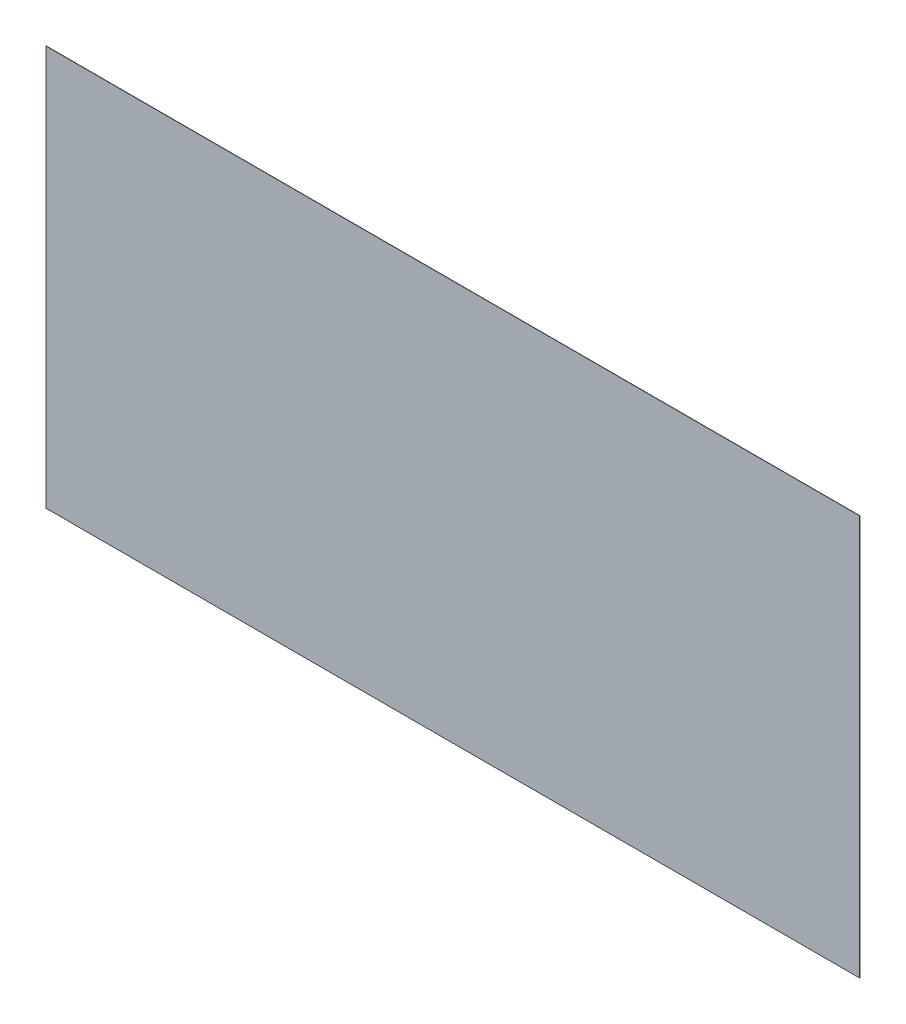
ISO-10303-21;
HEADER;
FILE_DESCRIPTION(('STEP AP214'),'2;1');
FILE_NAME('part.step','',(''),(''),'','','');
FILE_SCHEMA(('AUTOMOTIVE_DESIGN { 1 0 10303 214 1 1 1 1 }'));
ENDSEC;
DATA;
#1=APPLICATION_CONTEXT('core data for automotive mechanical design processes');
#2=APPLICATION_PROTOCOL_DEFINITION('international standard','automotive_design',2000,#1);
#3=PRODUCT_CONTEXT('',#1,'mechanical');
#4=PRODUCT('Part','Part','',(#3));
#5=PRODUCT_RELATED_PRODUCT_CATEGORY('part','',(#4));
#6=PRODUCT_DEFINITION_FORMATION('','',#4);
#7=PRODUCT_DEFINITION_CONTEXT('part definition',#1,'design');
#8=PRODUCT_DEFINITION('design','',#6,#7);
#9=PRODUCT_DEFINITION_SHAPE('','',#8);
#10=(LENGTH_UNIT() NAMED_UNIT(*) SI_UNIT(.MILLI.,.METRE.));
#11=(NAMED_UNIT(*) PLANE_ANGLE_UNIT() SI_UNIT($,.RADIAN.));
#12=(NAMED_UNIT(*) SI_UNIT($,.STERADIAN.) SOLID_ANGLE_UNIT());
#13=UNCERTAINTY_MEASURE_WITH_UNIT(LENGTH_MEASURE(1.E-05),#10,'distance_accuracy_value','');
#14=(GEOMETRIC_REPRESENTATION_CONTEXT(3) GLOBAL_UNCERTAINTY_ASSIGNED_CONTEXT((#13)) GLOBAL_UNIT_ASSIGNED_CONTEXT((#10,
#11,#12)) REPRESENTATION_CONTEXT('',''));
#15=CARTESIAN_POINT('',(0.,0.,0.));
#16=DIRECTION('',(0.,0.,1.));
#17=DIRECTION('',(1.,0.,0.));
#18=AXIS2_PLACEMENT_3D('',#15,#16,#17);
#19=CARTESIAN_POINT('',(-125.,-60.,151.4032));
#20=DIRECTION('',(1.,0.,0.));
#21=DIRECTION('',(0.,1.,0.));
#22=AXIS2_PLACEMENT_3D('',#19,#20,#21);
#23=PLANE('',#22);
#24=DIRECTION('',(0.,-1.,0.));
#25=VECTOR('',#24,1.);
#26=CARTESIAN_POINT('',(-125.,-60.,151.327));
#27=LINE('',#26,#25);
#28=CARTESIAN_POINT('',(-125.,63.,151.327));
#29=VERTEX_POINT('',#28);
#30=CARTESIAN_POINT('',(-125.,-60.,151.327));
#31=VERTEX_POINT('',#30);
#32=EDGE_CURVE('E118',#29,#31,#27,.T.);
#33=ORIENTED_EDGE('',*,*,#32,.T.);
#34=DIRECTION('',(0.,0.,-1.));
#35=VECTOR('',#34,1.);
#36=CARTESIAN_POINT('',(-125.,-60.,151.4032));
#37=LINE('',#36,#35);
#38=CARTESIAN_POINT('',(-125.,-60.,151.4032));
#39=VERTEX_POINT('',#38);
#40=EDGE_CURVE('E11',#39,#31,#37,.T.);
#41=ORIENTED_EDGE('',*,*,#40,.F.);
#42=DIRECTION('',(0.,-1.,0.));
#43=VECTOR('',#42,1.);
#44=CARTESIAN_POINT('',(-125.,-60.,151.4032));
#45=LINE('',#44,#43);
#46=CARTESIAN_POINT('',(-125.,63.,151.4032));
#47=VERTEX_POINT('',#46);
#48=EDGE_CURVE('E102',#47,#39,#45,.T.);
#49=ORIENTED_EDGE('',*,*,#48,.F.);
#50=DIRECTION('',(0.,0.,-1.));
#51=VECTOR('',#50,1.);
#52=CARTESIAN_POINT('',(-125.,63.,151.4032));
#53=LINE('',#52,#51);
#54=EDGE_CURVE('E114',#47,#29,#53,.T.);
#55=ORIENTED_EDGE('',*,*,#54,.T.);
#56=EDGE_LOOP('',(#33,#41,#49,#55));
#57=FACE_BOUND('',#56,.T.);
#58=ADVANCED_FACE('F50',(#57),#23,.F.);
#59=CARTESIAN_POINT('',(-125.,-60.,151.4032));
#60=DIRECTION('',(0.,1.,0.));
#61=DIRECTION('',(0.,0.,1.));
#62=AXIS2_PLACEMENT_3D('',#59,#60,#61);
#63=PLANE('',#62);
#64=DIRECTION('',(1.,0.,0.));
#65=VECTOR('',#64,1.);
#66=CARTESIAN_POINT('',(-125.,-60.,151.327));
#67=LINE('',#66,#65);
#68=CARTESIAN_POINT('',(125.,-60.,151.327));
#69=VERTEX_POINT('',#68);
#70=EDGE_CURVE('E107',#31,#69,#67,.T.);
#71=ORIENTED_EDGE('',*,*,#70,.T.);
#72=DIRECTION('',(0.,0.,-1.));
#73=VECTOR('',#72,1.);
#74=CARTESIAN_POINT('',(125.,-60.,151.4032));
#75=LINE('',#74,#73);
#76=CARTESIAN_POINT('',(125.,-60.,151.4032));
#77=VERTEX_POINT('',#76);
#78=EDGE_CURVE('E59',#77,#69,#75,.T.);
#79=ORIENTED_EDGE('',*,*,#78,.F.);
#80=DIRECTION('',(1.,0.,0.));
#81=VECTOR('',#80,1.);
#82=CARTESIAN_POINT('',(-125.,-60.,151.4032));
#83=LINE('',#82,#81);
#84=EDGE_CURVE('E97',#39,#77,#83,.T.);
#85=ORIENTED_EDGE('',*,*,#84,.F.);
#86=ORIENTED_EDGE('',*,*,#40,.T.);
#87=EDGE_LOOP('',(#71,#79,#85,#86));
#88=FACE_BOUND('',#87,.T.);
#89=ADVANCED_FACE('F106',(#88),#63,.F.);
#90=CARTESIAN_POINT('',(125.,-60.,151.4032));
#91=DIRECTION('',(-1.,0.,0.));
#92=DIRECTION('',(0.,-1.,0.));
#93=AXIS2_PLACEMENT_3D('',#90,#91,#92);
#94=PLANE('',#93);
#95=DIRECTION('',(0.,1.,0.));
#96=VECTOR('',#95,1.);
#97=CARTESIAN_POINT('',(125.,-60.,151.327));
#98=LINE('',#97,#96);
#99=CARTESIAN_POINT('',(125.,63.,151.327));
#100=VERTEX_POINT('',#99);
#101=EDGE_CURVE('E84',#69,#100,#98,.T.);
#102=ORIENTED_EDGE('',*,*,#101,.T.);
#103=DIRECTION('',(0.,0.,-1.));
#104=VECTOR('',#103,1.);
#105=CARTESIAN_POINT('',(125.,63.,151.4032));
#106=LINE('',#105,#104);
#107=CARTESIAN_POINT('',(125.,63.,151.4032));
#108=VERTEX_POINT('',#107);
#109=EDGE_CURVE('E109',#108,#100,#106,.T.);
#110=ORIENTED_EDGE('',*,*,#109,.F.);
#111=DIRECTION('',(0.,1.,0.));
#112=VECTOR('',#111,1.);
#113=CARTESIAN_POINT('',(125.,-60.,151.4032));
#114=LINE('',#113,#112);
#115=EDGE_CURVE('E100',#77,#108,#114,.T.);
#116=ORIENTED_EDGE('',*,*,#115,.F.);
#117=ORIENTED_EDGE('',*,*,#78,.T.);
#118=EDGE_LOOP('',(#102,#110,#116,#117));
#119=FACE_BOUND('',#118,.T.);
#120=ADVANCED_FACE('F110',(#119),#94,.F.);
#121=CARTESIAN_POINT('',(-125.,63.,151.4032));
#122=DIRECTION('',(0.,-1.,0.));
#123=DIRECTION('',(0.,0.,-1.));
#124=AXIS2_PLACEMENT_3D('',#121,#122,#123);
#125=PLANE('',#124);
#126=DIRECTION('',(-1.,0.,0.));
#127=VECTOR('',#126,1.);
#128=CARTESIAN_POINT('',(-125.,63.,151.327));
#129=LINE('',#128,#127);
#130=EDGE_CURVE('E90',#100,#29,#129,.T.);
#131=ORIENTED_EDGE('',*,*,#130,.T.);
#132=ORIENTED_EDGE('',*,*,#54,.F.);
#133=DIRECTION('',(-1.,0.,0.));
#134=VECTOR('',#133,1.);
#135=CARTESIAN_POINT('',(-125.,63.,151.4032));
#136=LINE('',#135,#134);
#137=EDGE_CURVE('E67',#108,#47,#136,.T.);
#138=ORIENTED_EDGE('',*,*,#137,.F.);
#139=ORIENTED_EDGE('',*,*,#109,.T.);
#140=EDGE_LOOP('',(#131,#132,#138,#139));
#141=FACE_BOUND('',#140,.T.);
#142=ADVANCED_FACE('F131',(#141),#125,.F.);
#143=CARTESIAN_POINT('',(0.,0.,151.4032));
#144=DIRECTION('',(0.,0.,-1.));
#145=DIRECTION('',(-1.,0.,0.));
#146=AXIS2_PLACEMENT_3D('',#143,#144,#145);
#147=PLANE('',#146);
#148=ORIENTED_EDGE('',*,*,#48,.T.);
#149=ORIENTED_EDGE('',*,*,#84,.T.);
#150=ORIENTED_EDGE('',*,*,#115,.T.);
#151=ORIENTED_EDGE('',*,*,#137,.T.);
#152=EDGE_LOOP('',(#148,#149,#150,#151));
#153=FACE_BOUND('',#152,.T.);
#154=ADVANCED_FACE('F98',(#153),#147,.F.);
#155=CARTESIAN_POINT('',(0.,0.,151.327));
#156=DIRECTION('',(0.,0.,-1.));
#157=DIRECTION('',(-1.,0.,0.));
#158=AXIS2_PLACEMENT_3D('',#155,#156,#157);
#159=PLANE('',#158);
#160=ORIENTED_EDGE('',*,*,#32,.F.);
#161=ORIENTED_EDGE('',*,*,#130,.F.);
#162=ORIENTED_EDGE('',*,*,#101,.F.);
#163=ORIENTED_EDGE('',*,*,#70,.F.);
#164=EDGE_LOOP('',(#160,#161,#162,#163));
#165=FACE_BOUND('',#164,.T.);
#166=ADVANCED_FACE('F134',(#165),#159,.T.);
#167=CLOSED_SHELL('',(#58,#89,#120,#142,#154,#166));
#168=MANIFOLD_SOLID_BREP('B2',#167);
#169=ADVANCED_BREP_SHAPE_REPRESENTATION('',(#18,#168),#14);
#170=SHAPE_DEFINITION_REPRESENTATION(#9,#169);
ENDSEC;
END-ISO-10303-21;
